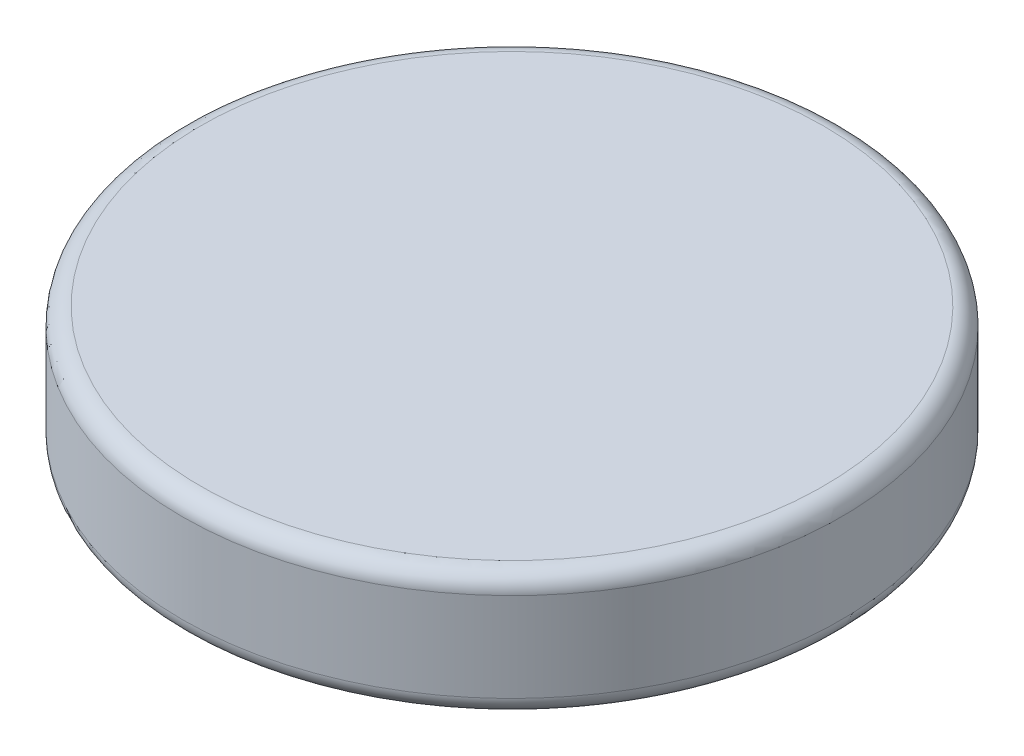
ISO-10303-21;
HEADER;
FILE_DESCRIPTION(('STEP AP214'),'2;1');
FILE_NAME('part.step','',(''),(''),'','','');
FILE_SCHEMA(('AUTOMOTIVE_DESIGN { 1 0 10303 214 1 1 1 1 }'));
ENDSEC;
DATA;
#1=APPLICATION_CONTEXT('core data for automotive mechanical design processes');
#2=APPLICATION_PROTOCOL_DEFINITION('international standard','automotive_design',2000,#1);
#3=PRODUCT_CONTEXT('',#1,'mechanical');
#4=PRODUCT('Part','Part','',(#3));
#5=PRODUCT_RELATED_PRODUCT_CATEGORY('part','',(#4));
#6=PRODUCT_DEFINITION_FORMATION('','',#4);
#7=PRODUCT_DEFINITION_CONTEXT('part definition',#1,'design');
#8=PRODUCT_DEFINITION('design','',#6,#7);
#9=PRODUCT_DEFINITION_SHAPE('','',#8);
#10=(LENGTH_UNIT() NAMED_UNIT(*) SI_UNIT(.MILLI.,.METRE.));
#11=(NAMED_UNIT(*) PLANE_ANGLE_UNIT() SI_UNIT($,.RADIAN.));
#12=(NAMED_UNIT(*) SI_UNIT($,.STERADIAN.) SOLID_ANGLE_UNIT());
#13=UNCERTAINTY_MEASURE_WITH_UNIT(LENGTH_MEASURE(1.E-05),#10,'distance_accuracy_value','');
#14=(GEOMETRIC_REPRESENTATION_CONTEXT(3) GLOBAL_UNCERTAINTY_ASSIGNED_CONTEXT((#13)) GLOBAL_UNIT_ASSIGNED_CONTEXT((#10,
#11,#12)) REPRESENTATION_CONTEXT('',''));
#15=CARTESIAN_POINT('',(0.,0.,0.));
#16=DIRECTION('',(0.,0.,1.));
#17=DIRECTION('',(1.,0.,0.));
#18=AXIS2_PLACEMENT_3D('',#15,#16,#17);
#19=CARTESIAN_POINT('',(8.99999999999999,1.5,0.));
#20=DIRECTION('',(0.,1.,0.));
#21=DIRECTION('',(0.,0.,1.));
#22=AXIS2_PLACEMENT_3D('',#19,#20,#21);
#23=PLANE('',#22);
#24=CARTESIAN_POINT('',(8.99999999999999,1.5,0.));
#25=DIRECTION('',(0.,1.,0.));
#26=DIRECTION('',(0.,0.,1.));
#27=AXIS2_PLACEMENT_3D('',#24,#25,#26);
#28=CIRCLE('',#27,6.49999999999999);
#29=CARTESIAN_POINT('',(8.99999999999999,1.5,6.49999999999999));
#30=VERTEX_POINT('',#29);
#31=EDGE_CURVE('E45',#30,#30,#28,.F.);
#32=ORIENTED_EDGE('',*,*,#31,.T.);
#33=EDGE_LOOP('',(#32));
#34=FACE_BOUND('',#33,.T.);
#35=CARTESIAN_POINT('',(8.99999999999999,1.5,0.));
#36=DIRECTION('',(0.,-1.,0.));
#37=DIRECTION('',(1.,0.,0.));
#38=AXIS2_PLACEMENT_3D('',#35,#36,#37);
#39=CIRCLE('',#38,4.14163738156364);
#40=CARTESIAN_POINT('',(13.1416373815636,1.5,0.));
#41=VERTEX_POINT('',#40);
#42=EDGE_CURVE('E78',#41,#41,#39,.T.);
#43=ORIENTED_EDGE('',*,*,#42,.F.);
#44=EDGE_LOOP('',(#43));
#45=FACE_BOUND('',#44,.T.);
#46=ADVANCED_FACE('F37',(#34,#45),#23,.F.);
#47=CARTESIAN_POINT('',(-9.5,11.5,0.));
#48=DIRECTION('',(0.,-1.,0.));
#49=DIRECTION('',(0.,0.,-1.));
#50=AXIS2_PLACEMENT_3D('',#47,#48,#49);
#51=PLANE('',#50);
#52=CARTESIAN_POINT('',(8.99999999999999,11.5,0.));
#53=DIRECTION('',(0.,-1.,0.));
#54=DIRECTION('',(0.,0.,-1.));
#55=AXIS2_PLACEMENT_3D('',#52,#53,#54);
#56=CIRCLE('',#55,17.5);
#57=CARTESIAN_POINT('',(8.99999999999999,11.5,-17.5));
#58=VERTEX_POINT('',#57);
#59=EDGE_CURVE('E55',#58,#58,#56,.F.);
#60=ORIENTED_EDGE('',*,*,#59,.T.);
#61=EDGE_LOOP('',(#60));
#62=FACE_BOUND('',#61,.T.);
#63=ADVANCED_FACE('F96',(#62),#51,.F.);
#64=CARTESIAN_POINT('',(8.99999999999999,1.5,0.));
#65=DIRECTION('',(0.,-1.,0.));
#66=DIRECTION('',(0.,0.,-1.));
#67=AXIS2_PLACEMENT_3D('',#64,#65,#66);
#68=CYLINDRICAL_SURFACE('',#67,18.5);
#69=CARTESIAN_POINT('',(8.99999999999999,10.5,0.));
#70=DIRECTION('',(0.,-1.,0.));
#71=DIRECTION('',(0.,0.,-1.));
#72=AXIS2_PLACEMENT_3D('',#69,#70,#71);
#73=CIRCLE('',#72,18.5);
#74=CARTESIAN_POINT('',(8.99999999999999,10.5,-18.5));
#75=VERTEX_POINT('',#74);
#76=EDGE_CURVE('E61',#75,#75,#73,.T.);
#77=ORIENTED_EDGE('',*,*,#76,.T.);
#78=EDGE_LOOP('',(#77));
#79=FACE_BOUND('',#78,.T.);
#80=CARTESIAN_POINT('',(8.99999999999999,5.5,0.));
#81=DIRECTION('',(0.,1.,0.));
#82=DIRECTION('',(0.,0.,1.));
#83=AXIS2_PLACEMENT_3D('',#80,#81,#82);
#84=CIRCLE('',#83,18.5);
#85=CARTESIAN_POINT('',(8.99999999999999,5.5,18.5));
#86=VERTEX_POINT('',#85);
#87=EDGE_CURVE('E65',#86,#86,#84,.T.);
#88=ORIENTED_EDGE('',*,*,#87,.T.);
#89=EDGE_LOOP('',(#88));
#90=FACE_BOUND('',#89,.T.);
#91=ADVANCED_FACE('F101',(#79,#90),#68,.T.);
#92=CARTESIAN_POINT('',(0.5,4.5,0.));
#93=DIRECTION('',(0.,1.,0.));
#94=DIRECTION('',(0.,0.,1.));
#95=AXIS2_PLACEMENT_3D('',#92,#93,#94);
#96=PLANE('',#95);
#97=CARTESIAN_POINT('',(8.99999999999999,4.5,0.));
#98=DIRECTION('',(0.,1.,0.));
#99=DIRECTION('',(0.,0.,1.));
#100=AXIS2_PLACEMENT_3D('',#97,#98,#99);
#101=CIRCLE('',#100,17.5);
#102=CARTESIAN_POINT('',(8.99999999999999,4.5,17.5));
#103=VERTEX_POINT('',#102);
#104=EDGE_CURVE('E50',#103,#103,#101,.F.);
#105=ORIENTED_EDGE('',*,*,#104,.T.);
#106=EDGE_LOOP('',(#105));
#107=FACE_BOUND('',#106,.T.);
#108=CARTESIAN_POINT('',(8.99999999999999,4.5,0.));
#109=DIRECTION('',(0.,-1.,0.));
#110=DIRECTION('',(0.,0.,-1.));
#111=AXIS2_PLACEMENT_3D('',#108,#109,#110);
#112=CIRCLE('',#111,8.49999999999999);
#113=CARTESIAN_POINT('',(8.99999999999999,4.5,-8.49999999999999));
#114=VERTEX_POINT('',#113);
#115=EDGE_CURVE('E69',#114,#114,#112,.T.);
#116=ORIENTED_EDGE('',*,*,#115,.F.);
#117=EDGE_LOOP('',(#116));
#118=FACE_BOUND('',#117,.T.);
#119=ADVANCED_FACE('F120',(#107,#118),#96,.F.);
#120=CARTESIAN_POINT('',(8.99999999999999,3.5,0.));
#121=DIRECTION('',(0.,-1.,0.));
#122=DIRECTION('',(0.,0.,-1.));
#123=AXIS2_PLACEMENT_3D('',#120,#121,#122);
#124=TOROIDAL_SURFACE('',#123,8.49999999999999,1.);
#125=CARTESIAN_POINT('',(8.99999999999999,3.5,0.));
#126=DIRECTION('',(0.,-1.,0.));
#127=DIRECTION('',(0.,0.,-1.));
#128=AXIS2_PLACEMENT_3D('',#125,#126,#127);
#129=CIRCLE('',#128,7.49999999999999);
#130=CARTESIAN_POINT('',(8.99999999999999,3.5,-7.49999999999999));
#131=VERTEX_POINT('',#130);
#132=EDGE_CURVE('E73',#131,#131,#129,.T.);
#133=ORIENTED_EDGE('',*,*,#132,.F.);
#134=EDGE_LOOP('',(#133));
#135=FACE_BOUND('',#134,.T.);
#136=ORIENTED_EDGE('',*,*,#115,.T.);
#137=EDGE_LOOP('',(#136));
#138=FACE_BOUND('',#137,.T.);
#139=ADVANCED_FACE('F123',(#135,#138),#124,.F.);
#140=CARTESIAN_POINT('',(8.99999999999999,1.5,0.));
#141=DIRECTION('',(0.,-1.,0.));
#142=DIRECTION('',(0.,0.,-1.));
#143=AXIS2_PLACEMENT_3D('',#140,#141,#142);
#144=CYLINDRICAL_SURFACE('',#143,7.49999999999999);
#145=CARTESIAN_POINT('',(8.99999999999999,2.5,0.));
#146=DIRECTION('',(0.,1.,0.));
#147=DIRECTION('',(0.,0.,1.));
#148=AXIS2_PLACEMENT_3D('',#145,#146,#147);
#149=CIRCLE('',#148,7.49999999999999);
#150=CARTESIAN_POINT('',(8.99999999999999,2.5,7.49999999999999));
#151=VERTEX_POINT('',#150);
#152=EDGE_CURVE('E10',#151,#151,#149,.T.);
#153=ORIENTED_EDGE('',*,*,#152,.T.);
#154=EDGE_LOOP('',(#153));
#155=FACE_BOUND('',#154,.T.);
#156=ORIENTED_EDGE('',*,*,#132,.T.);
#157=EDGE_LOOP('',(#156));
#158=FACE_BOUND('',#157,.T.);
#159=ADVANCED_FACE('F91',(#155,#158),#144,.T.);
#160=CARTESIAN_POINT('',(9.,8.5,0.));
#161=DIRECTION('',(0.,-1.,0.));
#162=DIRECTION('',(1.,0.,0.));
#163=AXIS2_PLACEMENT_3D('',#160,#161,#162);
#164=CYLINDRICAL_SURFACE('',#163,4.14163738156364);
#165=CARTESIAN_POINT('',(9.,8.5,0.));
#166=DIRECTION('',(0.,-1.,0.));
#167=DIRECTION('',(1.,0.,0.));
#168=AXIS2_PLACEMENT_3D('',#165,#166,#167);
#169=CIRCLE('',#168,4.14163738156364);
#170=CARTESIAN_POINT('',(13.1416373815636,8.5,0.));
#171=VERTEX_POINT('',#170);
#172=EDGE_CURVE('E77',#171,#171,#169,.T.);
#173=ORIENTED_EDGE('',*,*,#172,.F.);
#174=EDGE_LOOP('',(#173));
#175=FACE_BOUND('',#174,.T.);
#176=ORIENTED_EDGE('',*,*,#42,.T.);
#177=EDGE_LOOP('',(#176));
#178=FACE_BOUND('',#177,.T.);
#179=ADVANCED_FACE('F88',(#175,#178),#164,.F.);
#180=CARTESIAN_POINT('',(9.,8.5,0.));
#181=DIRECTION('',(0.,-1.,0.));
#182=DIRECTION('',(1.,0.,0.));
#183=AXIS2_PLACEMENT_3D('',#180,#181,#182);
#184=PLANE('',#183);
#185=ORIENTED_EDGE('',*,*,#172,.T.);
#186=EDGE_LOOP('',(#185));
#187=FACE_BOUND('',#186,.T.);
#188=ADVANCED_FACE('F86',(#187),#184,.T.);
#189=CARTESIAN_POINT('',(8.99999999999999,10.5,0.));
#190=DIRECTION('',(0.,-1.,0.));
#191=DIRECTION('',(0.,0.,-1.));
#192=AXIS2_PLACEMENT_3D('',#189,#190,#191);
#193=TOROIDAL_SURFACE('',#192,17.5,1.);
#194=ORIENTED_EDGE('',*,*,#59,.F.);
#195=EDGE_LOOP('',(#194));
#196=FACE_BOUND('',#195,.T.);
#197=ORIENTED_EDGE('',*,*,#76,.F.);
#198=EDGE_LOOP('',(#197));
#199=FACE_BOUND('',#198,.T.);
#200=ADVANCED_FACE('F106',(#196,#199),#193,.T.);
#201=CARTESIAN_POINT('',(8.99999999999999,5.5,0.));
#202=DIRECTION('',(0.,1.,0.));
#203=DIRECTION('',(0.,0.,1.));
#204=AXIS2_PLACEMENT_3D('',#201,#202,#203);
#205=TOROIDAL_SURFACE('',#204,17.5,1.);
#206=ORIENTED_EDGE('',*,*,#87,.F.);
#207=EDGE_LOOP('',(#206));
#208=FACE_BOUND('',#207,.T.);
#209=ORIENTED_EDGE('',*,*,#104,.F.);
#210=EDGE_LOOP('',(#209));
#211=FACE_BOUND('',#210,.T.);
#212=ADVANCED_FACE('F108',(#208,#211),#205,.T.);
#213=CARTESIAN_POINT('',(8.99999999999999,2.5,0.));
#214=DIRECTION('',(0.,1.,0.));
#215=DIRECTION('',(0.,0.,1.));
#216=AXIS2_PLACEMENT_3D('',#213,#214,#215);
#217=TOROIDAL_SURFACE('',#216,6.49999999999999,1.);
#218=ORIENTED_EDGE('',*,*,#152,.F.);
#219=EDGE_LOOP('',(#218));
#220=FACE_BOUND('',#219,.T.);
#221=ORIENTED_EDGE('',*,*,#31,.F.);
#222=EDGE_LOOP('',(#221));
#223=FACE_BOUND('',#222,.T.);
#224=ADVANCED_FACE('F39',(#220,#223),#217,.T.);
#225=CLOSED_SHELL('',(#46,#63,#91,#119,#139,#159,#179,#188,#200,#212,#224));
#226=MANIFOLD_SOLID_BREP('B2',#225);
#227=ADVANCED_BREP_SHAPE_REPRESENTATION('',(#18,#226),#14);
#228=SHAPE_DEFINITION_REPRESENTATION(#9,#227);
ENDSEC;
END-ISO-10303-21;
